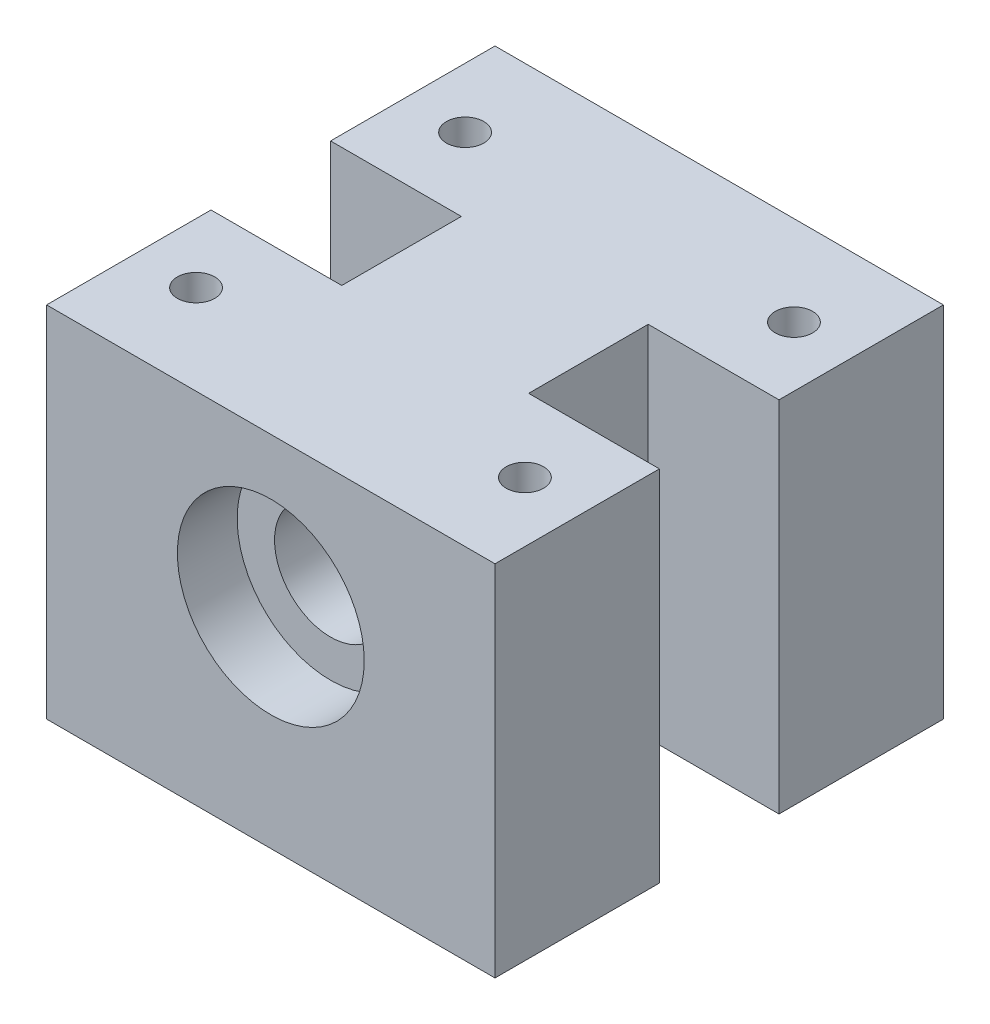
ISO-10303-21;
HEADER;
FILE_DESCRIPTION(('STEP AP214'),'2;1');
FILE_NAME('part.step','',(''),(''),'','','');
FILE_SCHEMA(('AUTOMOTIVE_DESIGN { 1 0 10303 214 1 1 1 1 }'));
ENDSEC;
DATA;
#1=APPLICATION_CONTEXT('core data for automotive mechanical design processes');
#2=APPLICATION_PROTOCOL_DEFINITION('international standard','automotive_design',2000,#1);
#3=PRODUCT_CONTEXT('',#1,'mechanical');
#4=PRODUCT('Part','Part','',(#3));
#5=PRODUCT_RELATED_PRODUCT_CATEGORY('part','',(#4));
#6=PRODUCT_DEFINITION_FORMATION('','',#4);
#7=PRODUCT_DEFINITION_CONTEXT('part definition',#1,'design');
#8=PRODUCT_DEFINITION('design','',#6,#7);
#9=PRODUCT_DEFINITION_SHAPE('','',#8);
#10=(LENGTH_UNIT() NAMED_UNIT(*) SI_UNIT(.MILLI.,.METRE.));
#11=(NAMED_UNIT(*) PLANE_ANGLE_UNIT() SI_UNIT($,.RADIAN.));
#12=(NAMED_UNIT(*) SI_UNIT($,.STERADIAN.) SOLID_ANGLE_UNIT());
#13=UNCERTAINTY_MEASURE_WITH_UNIT(LENGTH_MEASURE(1.E-05),#10,'distance_accuracy_value','');
#14=(GEOMETRIC_REPRESENTATION_CONTEXT(3) GLOBAL_UNCERTAINTY_ASSIGNED_CONTEXT((#13)) GLOBAL_UNIT_ASSIGNED_CONTEXT((#10,
#11,#12)) REPRESENTATION_CONTEXT('',''));
#15=CARTESIAN_POINT('',(0.,0.,0.));
#16=DIRECTION('',(0.,0.,1.));
#17=DIRECTION('',(1.,0.,0.));
#18=AXIS2_PLACEMENT_3D('',#15,#16,#17);
#19=CARTESIAN_POINT('',(-19.05,-17.78,19.05));
#20=DIRECTION('',(1.,0.,0.));
#21=DIRECTION('',(0.,0.,-1.));
#22=AXIS2_PLACEMENT_3D('',#19,#20,#21);
#23=PLANE('',#22);
#24=DIRECTION('',(0.,0.,1.));
#25=VECTOR('',#24,1.);
#26=CARTESIAN_POINT('',(-19.05,12.7,-19.05));
#27=LINE('',#26,#25);
#28=CARTESIAN_POINT('',(-19.05,12.7,-19.05));
#29=VERTEX_POINT('',#28);
#30=CARTESIAN_POINT('',(-19.05,12.7,-5.08));
#31=VERTEX_POINT('',#30);
#32=EDGE_CURVE('E133',#29,#31,#27,.T.);
#33=ORIENTED_EDGE('',*,*,#32,.F.);
#34=DIRECTION('',(0.,-1.,0.));
#35=VECTOR('',#34,1.);
#36=CARTESIAN_POINT('',(-19.05,-17.78,-19.05));
#37=LINE('',#36,#35);
#38=CARTESIAN_POINT('',(-19.05,-17.78,-19.05));
#39=VERTEX_POINT('',#38);
#40=EDGE_CURVE('E224',#29,#39,#37,.T.);
#41=ORIENTED_EDGE('',*,*,#40,.T.);
#42=DIRECTION('',(0.,0.,-1.));
#43=VECTOR('',#42,1.);
#44=CARTESIAN_POINT('',(-19.05,-17.78,19.05));
#45=LINE('',#44,#43);
#46=CARTESIAN_POINT('',(-19.05,-17.78,-5.08));
#47=VERTEX_POINT('',#46);
#48=EDGE_CURVE('E54',#47,#39,#45,.T.);
#49=ORIENTED_EDGE('',*,*,#48,.F.);
#50=DIRECTION('',(0.,1.,0.));
#51=VECTOR('',#50,1.);
#52=CARTESIAN_POINT('',(-19.05,-17.78,-5.08));
#53=LINE('',#52,#51);
#54=EDGE_CURVE('E147',#47,#31,#53,.T.);
#55=ORIENTED_EDGE('',*,*,#54,.T.);
#56=EDGE_LOOP('',(#33,#41,#49,#55));
#57=FACE_BOUND('',#56,.T.);
#58=ADVANCED_FACE('F45',(#57),#23,.F.);
#59=DIRECTION('',(0.,0.,1.));
#60=VECTOR('',#59,1.);
#61=CARTESIAN_POINT('',(-19.05,12.7,5.08));
#62=LINE('',#61,#60);
#63=CARTESIAN_POINT('',(-19.05,12.7,5.08));
#64=VERTEX_POINT('',#63);
#65=CARTESIAN_POINT('',(-19.05,12.7,19.05));
#66=VERTEX_POINT('',#65);
#67=EDGE_CURVE('E276',#64,#66,#62,.T.);
#68=ORIENTED_EDGE('',*,*,#67,.F.);
#69=DIRECTION('',(0.,1.,0.));
#70=VECTOR('',#69,1.);
#71=CARTESIAN_POINT('',(-19.05,-17.78,5.08));
#72=LINE('',#71,#70);
#73=CARTESIAN_POINT('',(-19.05,-17.78,5.08));
#74=VERTEX_POINT('',#73);
#75=EDGE_CURVE('E165',#74,#64,#72,.T.);
#76=ORIENTED_EDGE('',*,*,#75,.F.);
#77=CARTESIAN_POINT('',(-19.05,-17.78,19.05));
#78=VERTEX_POINT('',#77);
#79=EDGE_CURVE('E13',#78,#74,#45,.T.);
#80=ORIENTED_EDGE('',*,*,#79,.F.);
#81=DIRECTION('',(0.,-1.,0.));
#82=VECTOR('',#81,1.);
#83=CARTESIAN_POINT('',(-19.05,-17.78,19.05));
#84=LINE('',#83,#82);
#85=EDGE_CURVE('E216',#66,#78,#84,.T.);
#86=ORIENTED_EDGE('',*,*,#85,.F.);
#87=EDGE_LOOP('',(#68,#76,#80,#86));
#88=FACE_BOUND('',#87,.T.);
#89=ADVANCED_FACE('F274',(#88),#23,.F.);
#90=CARTESIAN_POINT('',(19.05,-17.78,19.05));
#91=DIRECTION('',(-1.,0.,0.));
#92=DIRECTION('',(0.,0.,1.));
#93=AXIS2_PLACEMENT_3D('',#90,#91,#92);
#94=PLANE('',#93);
#95=DIRECTION('',(0.,0.,-1.));
#96=VECTOR('',#95,1.);
#97=CARTESIAN_POINT('',(19.05,12.7,19.05));
#98=LINE('',#97,#96);
#99=CARTESIAN_POINT('',(19.05,12.7,19.05));
#100=VERTEX_POINT('',#99);
#101=CARTESIAN_POINT('',(19.05,12.7,5.08));
#102=VERTEX_POINT('',#101);
#103=EDGE_CURVE('E281',#100,#102,#98,.T.);
#104=ORIENTED_EDGE('',*,*,#103,.F.);
#105=DIRECTION('',(0.,1.,0.));
#106=VECTOR('',#105,1.);
#107=CARTESIAN_POINT('',(19.05,-17.78,19.05));
#108=LINE('',#107,#106);
#109=CARTESIAN_POINT('',(19.05,-17.78,19.05));
#110=VERTEX_POINT('',#109);
#111=EDGE_CURVE('E213',#110,#100,#108,.T.);
#112=ORIENTED_EDGE('',*,*,#111,.F.);
#113=DIRECTION('',(0.,0.,-1.));
#114=VECTOR('',#113,1.);
#115=CARTESIAN_POINT('',(19.05,-17.78,19.05));
#116=LINE('',#115,#114);
#117=CARTESIAN_POINT('',(19.05,-17.78,5.08));
#118=VERTEX_POINT('',#117);
#119=EDGE_CURVE('E228',#110,#118,#116,.T.);
#120=ORIENTED_EDGE('',*,*,#119,.T.);
#121=DIRECTION('',(0.,1.,0.));
#122=VECTOR('',#121,1.);
#123=CARTESIAN_POINT('',(19.05,-17.78,5.08));
#124=LINE('',#123,#122);
#125=EDGE_CURVE('E174',#118,#102,#124,.T.);
#126=ORIENTED_EDGE('',*,*,#125,.T.);
#127=EDGE_LOOP('',(#104,#112,#120,#126));
#128=FACE_BOUND('',#127,.T.);
#129=ADVANCED_FACE('F47',(#128),#94,.F.);
#130=DIRECTION('',(0.,0.,-1.));
#131=VECTOR('',#130,1.);
#132=CARTESIAN_POINT('',(19.05,12.7,-5.08));
#133=LINE('',#132,#131);
#134=CARTESIAN_POINT('',(19.05,12.7,-5.08));
#135=VERTEX_POINT('',#134);
#136=CARTESIAN_POINT('',(19.05,12.7,-19.05));
#137=VERTEX_POINT('',#136);
#138=EDGE_CURVE('E245',#135,#137,#133,.T.);
#139=ORIENTED_EDGE('',*,*,#138,.F.);
#140=DIRECTION('',(0.,1.,0.));
#141=VECTOR('',#140,1.);
#142=CARTESIAN_POINT('',(19.05,-17.78,-5.08));
#143=LINE('',#142,#141);
#144=CARTESIAN_POINT('',(19.05,-17.78,-5.08));
#145=VERTEX_POINT('',#144);
#146=EDGE_CURVE('E173',#145,#135,#143,.T.);
#147=ORIENTED_EDGE('',*,*,#146,.F.);
#148=CARTESIAN_POINT('',(19.05,-17.78,-19.05));
#149=VERTEX_POINT('',#148);
#150=EDGE_CURVE('E221',#145,#149,#116,.T.);
#151=ORIENTED_EDGE('',*,*,#150,.T.);
#152=DIRECTION('',(0.,1.,0.));
#153=VECTOR('',#152,1.);
#154=CARTESIAN_POINT('',(19.05,-17.78,-19.05));
#155=LINE('',#154,#153);
#156=EDGE_CURVE('E210',#149,#137,#155,.T.);
#157=ORIENTED_EDGE('',*,*,#156,.T.);
#158=EDGE_LOOP('',(#139,#147,#151,#157));
#159=FACE_BOUND('',#158,.T.);
#160=ADVANCED_FACE('F237',(#159),#94,.F.);
#161=CARTESIAN_POINT('',(0.,0.,19.05));
#162=DIRECTION('',(0.,0.,-1.));
#163=DIRECTION('',(-1.,0.,0.));
#164=AXIS2_PLACEMENT_3D('',#161,#162,#163);
#165=PLANE('',#164);
#166=CARTESIAN_POINT('',(0.,0.,19.05));
#167=DIRECTION('',(0.,0.,1.));
#168=DIRECTION('',(1.,0.,0.));
#169=AXIS2_PLACEMENT_3D('',#166,#167,#168);
#170=CIRCLE('',#169,7.9375);
#171=CARTESIAN_POINT('',(7.9375,0.,19.05));
#172=VERTEX_POINT('',#171);
#173=EDGE_CURVE('E206',#172,#172,#170,.T.);
#174=ORIENTED_EDGE('',*,*,#173,.F.);
#175=EDGE_LOOP('',(#174));
#176=FACE_BOUND('',#175,.T.);
#177=DIRECTION('',(1.,0.,0.));
#178=VECTOR('',#177,1.);
#179=CARTESIAN_POINT('',(-19.05,12.7,19.05));
#180=LINE('',#179,#178);
#181=EDGE_CURVE('E278',#66,#100,#180,.T.);
#182=ORIENTED_EDGE('',*,*,#181,.F.);
#183=ORIENTED_EDGE('',*,*,#85,.T.);
#184=DIRECTION('',(1.,0.,0.));
#185=VECTOR('',#184,1.);
#186=CARTESIAN_POINT('',(-19.05,-17.78,19.05));
#187=LINE('',#186,#185);
#188=EDGE_CURVE('E219',#78,#110,#187,.T.);
#189=ORIENTED_EDGE('',*,*,#188,.T.);
#190=ORIENTED_EDGE('',*,*,#111,.T.);
#191=EDGE_LOOP('',(#182,#183,#189,#190));
#192=FACE_BOUND('',#191,.T.);
#193=ADVANCED_FACE('F303',(#176,#192),#165,.F.);
#194=CARTESIAN_POINT('',(0.,0.,-19.05));
#195=DIRECTION('',(0.,0.,-1.));
#196=DIRECTION('',(-1.,0.,0.));
#197=AXIS2_PLACEMENT_3D('',#194,#195,#196);
#198=PLANE('',#197);
#199=CARTESIAN_POINT('',(0.,0.,-19.05));
#200=DIRECTION('',(0.,0.,1.));
#201=DIRECTION('',(1.,0.,0.));
#202=AXIS2_PLACEMENT_3D('',#199,#200,#201);
#203=CIRCLE('',#202,7.9375);
#204=CARTESIAN_POINT('',(7.9375,0.,-19.05));
#205=VERTEX_POINT('',#204);
#206=EDGE_CURVE('E197',#205,#205,#203,.T.);
#207=ORIENTED_EDGE('',*,*,#206,.T.);
#208=EDGE_LOOP('',(#207));
#209=FACE_BOUND('',#208,.T.);
#210=ORIENTED_EDGE('',*,*,#40,.F.);
#211=DIRECTION('',(-1.,0.,0.));
#212=VECTOR('',#211,1.);
#213=CARTESIAN_POINT('',(19.05,12.7,-19.05));
#214=LINE('',#213,#212);
#215=EDGE_CURVE('E139',#137,#29,#214,.T.);
#216=ORIENTED_EDGE('',*,*,#215,.F.);
#217=ORIENTED_EDGE('',*,*,#156,.F.);
#218=DIRECTION('',(1.,0.,0.));
#219=VECTOR('',#218,1.);
#220=CARTESIAN_POINT('',(-19.05,-17.78,-19.05));
#221=LINE('',#220,#219);
#222=EDGE_CURVE('E217',#39,#149,#221,.T.);
#223=ORIENTED_EDGE('',*,*,#222,.F.);
#224=EDGE_LOOP('',(#210,#216,#217,#223));
#225=FACE_BOUND('',#224,.T.);
#226=ADVANCED_FACE('F243',(#209,#225),#198,.T.);
#227=CARTESIAN_POINT('',(13.97,17.78,11.43));
#228=DIRECTION('',(0.,-1.,0.));
#229=DIRECTION('',(0.,0.,-1.));
#230=AXIS2_PLACEMENT_3D('',#227,#228,#229);
#231=CYLINDRICAL_SURFACE('',#230,1.5875);
#232=CARTESIAN_POINT('',(13.97,-17.78,11.43));
#233=DIRECTION('',(0.,-1.,0.));
#234=DIRECTION('',(0.,0.,-1.));
#235=AXIS2_PLACEMENT_3D('',#232,#233,#234);
#236=CIRCLE('',#235,1.5875);
#237=CARTESIAN_POINT('',(13.97,-17.78,9.8425));
#238=VERTEX_POINT('',#237);
#239=EDGE_CURVE('E189',#238,#238,#236,.T.);
#240=ORIENTED_EDGE('',*,*,#239,.T.);
#241=EDGE_LOOP('',(#240));
#242=FACE_BOUND('',#241,.T.);
#243=CARTESIAN_POINT('',(13.97,12.7,11.43));
#244=DIRECTION('',(0.,1.,0.));
#245=DIRECTION('',(0.,0.,1.));
#246=AXIS2_PLACEMENT_3D('',#243,#244,#245);
#247=CIRCLE('',#246,1.5875);
#248=CARTESIAN_POINT('',(13.97,12.7,13.0175));
#249=VERTEX_POINT('',#248);
#250=EDGE_CURVE('E259',#249,#249,#247,.F.);
#251=ORIENTED_EDGE('',*,*,#250,.F.);
#252=EDGE_LOOP('',(#251));
#253=FACE_BOUND('',#252,.T.);
#254=ADVANCED_FACE('F311',(#242,#253),#231,.F.);
#255=CARTESIAN_POINT('',(13.97,17.78,-11.43));
#256=DIRECTION('',(0.,-1.,0.));
#257=DIRECTION('',(0.,0.,-1.));
#258=AXIS2_PLACEMENT_3D('',#255,#256,#257);
#259=CYLINDRICAL_SURFACE('',#258,1.5875);
#260=CARTESIAN_POINT('',(13.97,-17.78,-11.43));
#261=DIRECTION('',(0.,-1.,0.));
#262=DIRECTION('',(0.,0.,-1.));
#263=AXIS2_PLACEMENT_3D('',#260,#261,#262);
#264=CIRCLE('',#263,1.5875);
#265=CARTESIAN_POINT('',(13.97,-17.78,-13.0175));
#266=VERTEX_POINT('',#265);
#267=EDGE_CURVE('E186',#266,#266,#264,.T.);
#268=ORIENTED_EDGE('',*,*,#267,.T.);
#269=EDGE_LOOP('',(#268));
#270=FACE_BOUND('',#269,.T.);
#271=CARTESIAN_POINT('',(13.97,12.7,-11.43));
#272=DIRECTION('',(0.,1.,0.));
#273=DIRECTION('',(0.,0.,1.));
#274=AXIS2_PLACEMENT_3D('',#271,#272,#273);
#275=CIRCLE('',#274,1.5875);
#276=CARTESIAN_POINT('',(13.97,12.7,-9.8425));
#277=VERTEX_POINT('',#276);
#278=EDGE_CURVE('E256',#277,#277,#275,.F.);
#279=ORIENTED_EDGE('',*,*,#278,.F.);
#280=EDGE_LOOP('',(#279));
#281=FACE_BOUND('',#280,.T.);
#282=ADVANCED_FACE('F357',(#270,#281),#259,.F.);
#283=CARTESIAN_POINT('',(-13.97,17.78,-11.43));
#284=DIRECTION('',(0.,-1.,0.));
#285=DIRECTION('',(0.,0.,-1.));
#286=AXIS2_PLACEMENT_3D('',#283,#284,#285);
#287=CYLINDRICAL_SURFACE('',#286,1.5875);
#288=CARTESIAN_POINT('',(-13.97,-17.78,-11.43));
#289=DIRECTION('',(0.,-1.,0.));
#290=DIRECTION('',(0.,0.,-1.));
#291=AXIS2_PLACEMENT_3D('',#288,#289,#290);
#292=CIRCLE('',#291,1.5875);
#293=CARTESIAN_POINT('',(-13.97,-17.78,-13.0175));
#294=VERTEX_POINT('',#293);
#295=EDGE_CURVE('E190',#294,#294,#292,.T.);
#296=ORIENTED_EDGE('',*,*,#295,.T.);
#297=EDGE_LOOP('',(#296));
#298=FACE_BOUND('',#297,.T.);
#299=CARTESIAN_POINT('',(-13.97,12.7,-11.43));
#300=DIRECTION('',(0.,1.,0.));
#301=DIRECTION('',(0.,0.,1.));
#302=AXIS2_PLACEMENT_3D('',#299,#300,#301);
#303=CIRCLE('',#302,1.5875);
#304=CARTESIAN_POINT('',(-13.97,12.7,-9.8425));
#305=VERTEX_POINT('',#304);
#306=EDGE_CURVE('E248',#305,#305,#303,.F.);
#307=ORIENTED_EDGE('',*,*,#306,.F.);
#308=EDGE_LOOP('',(#307));
#309=FACE_BOUND('',#308,.T.);
#310=ADVANCED_FACE('F343',(#298,#309),#287,.F.);
#311=CARTESIAN_POINT('',(-13.97,17.78,11.43));
#312=DIRECTION('',(0.,-1.,0.));
#313=DIRECTION('',(0.,0.,-1.));
#314=AXIS2_PLACEMENT_3D('',#311,#312,#313);
#315=CYLINDRICAL_SURFACE('',#314,1.5875);
#316=CARTESIAN_POINT('',(-13.97,-17.78,11.43));
#317=DIRECTION('',(0.,-1.,0.));
#318=DIRECTION('',(0.,0.,-1.));
#319=AXIS2_PLACEMENT_3D('',#316,#317,#318);
#320=CIRCLE('',#319,1.5875);
#321=CARTESIAN_POINT('',(-13.97,-17.78,9.8425));
#322=VERTEX_POINT('',#321);
#323=EDGE_CURVE('E177',#322,#322,#320,.T.);
#324=ORIENTED_EDGE('',*,*,#323,.T.);
#325=EDGE_LOOP('',(#324));
#326=FACE_BOUND('',#325,.T.);
#327=CARTESIAN_POINT('',(-13.97,12.7,11.43));
#328=DIRECTION('',(0.,1.,0.));
#329=DIRECTION('',(0.,0.,1.));
#330=AXIS2_PLACEMENT_3D('',#327,#328,#329);
#331=CIRCLE('',#330,1.5875);
#332=CARTESIAN_POINT('',(-13.97,12.7,13.0175));
#333=VERTEX_POINT('',#332);
#334=EDGE_CURVE('E244',#333,#333,#331,.F.);
#335=ORIENTED_EDGE('',*,*,#334,.F.);
#336=EDGE_LOOP('',(#335));
#337=FACE_BOUND('',#336,.T.);
#338=ADVANCED_FACE('F340',(#326,#337),#315,.F.);
#339=CARTESIAN_POINT('',(19.05,-17.78,5.08));
#340=DIRECTION('',(0.,0.,1.));
#341=DIRECTION('',(1.,0.,0.));
#342=AXIS2_PLACEMENT_3D('',#339,#340,#341);
#343=PLANE('',#342);
#344=DIRECTION('',(-1.,0.,0.));
#345=VECTOR('',#344,1.);
#346=CARTESIAN_POINT('',(19.05,12.7,5.08));
#347=LINE('',#346,#345);
#348=CARTESIAN_POINT('',(7.9375,12.7,5.08));
#349=VERTEX_POINT('',#348);
#350=EDGE_CURVE('E287',#102,#349,#347,.T.);
#351=ORIENTED_EDGE('',*,*,#350,.F.);
#352=ORIENTED_EDGE('',*,*,#125,.F.);
#353=DIRECTION('',(1.,0.,0.));
#354=VECTOR('',#353,1.);
#355=CARTESIAN_POINT('',(19.05,-17.78,5.08));
#356=LINE('',#355,#354);
#357=CARTESIAN_POINT('',(7.9375,-17.78,5.08));
#358=VERTEX_POINT('',#357);
#359=EDGE_CURVE('E170',#358,#118,#356,.T.);
#360=ORIENTED_EDGE('',*,*,#359,.F.);
#361=DIRECTION('',(0.,1.,0.));
#362=VECTOR('',#361,1.);
#363=CARTESIAN_POINT('',(7.9375,-17.78,5.08));
#364=LINE('',#363,#362);
#365=EDGE_CURVE('E178',#358,#349,#364,.T.);
#366=ORIENTED_EDGE('',*,*,#365,.T.);
#367=EDGE_LOOP('',(#351,#352,#360,#366));
#368=FACE_BOUND('',#367,.T.);
#369=ADVANCED_FACE('F300',(#368),#343,.F.);
#370=CARTESIAN_POINT('',(7.9375,-17.78,-5.08));
#371=DIRECTION('',(-1.,0.,0.));
#372=DIRECTION('',(0.,0.,1.));
#373=AXIS2_PLACEMENT_3D('',#370,#371,#372);
#374=PLANE('',#373);
#375=DIRECTION('',(0.,0.,-1.));
#376=VECTOR('',#375,1.);
#377=CARTESIAN_POINT('',(7.9375,12.7,5.08));
#378=LINE('',#377,#376);
#379=CARTESIAN_POINT('',(7.9375,12.7,-5.08));
#380=VERTEX_POINT('',#379);
#381=EDGE_CURVE('E289',#349,#380,#378,.T.);
#382=ORIENTED_EDGE('',*,*,#381,.F.);
#383=ORIENTED_EDGE('',*,*,#365,.F.);
#384=DIRECTION('',(0.,0.,1.));
#385=VECTOR('',#384,1.);
#386=CARTESIAN_POINT('',(7.9375,-17.78,-5.08));
#387=LINE('',#386,#385);
#388=CARTESIAN_POINT('',(7.9375,-17.78,-5.08));
#389=VERTEX_POINT('',#388);
#390=EDGE_CURVE('E157',#389,#358,#387,.T.);
#391=ORIENTED_EDGE('',*,*,#390,.F.);
#392=DIRECTION('',(0.,1.,0.));
#393=VECTOR('',#392,1.);
#394=CARTESIAN_POINT('',(7.9375,-17.78,-5.08));
#395=LINE('',#394,#393);
#396=EDGE_CURVE('E181',#389,#380,#395,.T.);
#397=ORIENTED_EDGE('',*,*,#396,.T.);
#398=EDGE_LOOP('',(#382,#383,#391,#397));
#399=FACE_BOUND('',#398,.T.);
#400=ADVANCED_FACE('F297',(#399),#374,.F.);
#401=CARTESIAN_POINT('',(19.05,-17.78,-5.08));
#402=DIRECTION('',(0.,0.,-1.));
#403=DIRECTION('',(-1.,0.,0.));
#404=AXIS2_PLACEMENT_3D('',#401,#402,#403);
#405=PLANE('',#404);
#406=DIRECTION('',(1.,0.,0.));
#407=VECTOR('',#406,1.);
#408=CARTESIAN_POINT('',(7.9375,12.7,-5.08));
#409=LINE('',#408,#407);
#410=EDGE_CURVE('E250',#380,#135,#409,.T.);
#411=ORIENTED_EDGE('',*,*,#410,.F.);
#412=ORIENTED_EDGE('',*,*,#396,.F.);
#413=DIRECTION('',(-1.,0.,0.));
#414=VECTOR('',#413,1.);
#415=CARTESIAN_POINT('',(19.05,-17.78,-5.08));
#416=LINE('',#415,#414);
#417=EDGE_CURVE('E154',#145,#389,#416,.T.);
#418=ORIENTED_EDGE('',*,*,#417,.F.);
#419=ORIENTED_EDGE('',*,*,#146,.T.);
#420=EDGE_LOOP('',(#411,#412,#418,#419));
#421=FACE_BOUND('',#420,.T.);
#422=ADVANCED_FACE('F294',(#421),#405,.F.);
#423=CARTESIAN_POINT('',(-19.05,-17.78,-5.08));
#424=DIRECTION('',(0.,0.,1.));
#425=DIRECTION('',(1.,0.,0.));
#426=AXIS2_PLACEMENT_3D('',#423,#424,#425);
#427=PLANE('',#426);
#428=DIRECTION('',(0.,1.,0.));
#429=VECTOR('',#428,1.);
#430=CARTESIAN_POINT('',(-7.9375,-17.78,-5.08));
#431=LINE('',#430,#429);
#432=CARTESIAN_POINT('',(-7.9375,-17.78,-5.08));
#433=VERTEX_POINT('',#432);
#434=CARTESIAN_POINT('',(-7.9375,12.7,-5.08));
#435=VERTEX_POINT('',#434);
#436=EDGE_CURVE('E150',#433,#435,#431,.T.);
#437=ORIENTED_EDGE('',*,*,#436,.T.);
#438=DIRECTION('',(1.,0.,0.));
#439=VECTOR('',#438,1.);
#440=CARTESIAN_POINT('',(-19.05,12.7,-5.08));
#441=LINE('',#440,#439);
#442=EDGE_CURVE('E137',#31,#435,#441,.T.);
#443=ORIENTED_EDGE('',*,*,#442,.F.);
#444=ORIENTED_EDGE('',*,*,#54,.F.);
#445=DIRECTION('',(1.,0.,0.));
#446=VECTOR('',#445,1.);
#447=CARTESIAN_POINT('',(-19.05,-17.78,-5.08));
#448=LINE('',#447,#446);
#449=EDGE_CURVE('E161',#47,#433,#448,.T.);
#450=ORIENTED_EDGE('',*,*,#449,.T.);
#451=EDGE_LOOP('',(#437,#443,#444,#450));
#452=FACE_BOUND('',#451,.T.);
#453=ADVANCED_FACE('F146',(#452),#427,.T.);
#454=CARTESIAN_POINT('',(-7.9375,-17.78,-5.08));
#455=DIRECTION('',(-1.,0.,0.));
#456=DIRECTION('',(0.,0.,1.));
#457=AXIS2_PLACEMENT_3D('',#454,#455,#456);
#458=PLANE('',#457);
#459=DIRECTION('',(0.,1.,0.));
#460=VECTOR('',#459,1.);
#461=CARTESIAN_POINT('',(-7.9375,-17.78,5.08));
#462=LINE('',#461,#460);
#463=CARTESIAN_POINT('',(-7.9375,-17.78,5.08));
#464=VERTEX_POINT('',#463);
#465=CARTESIAN_POINT('',(-7.9375,12.7,5.08));
#466=VERTEX_POINT('',#465);
#467=EDGE_CURVE('E68',#464,#466,#462,.T.);
#468=ORIENTED_EDGE('',*,*,#467,.T.);
#469=DIRECTION('',(0.,0.,1.));
#470=VECTOR('',#469,1.);
#471=CARTESIAN_POINT('',(-7.9375,12.7,-5.08));
#472=LINE('',#471,#470);
#473=EDGE_CURVE('E61',#435,#466,#472,.T.);
#474=ORIENTED_EDGE('',*,*,#473,.F.);
#475=ORIENTED_EDGE('',*,*,#436,.F.);
#476=DIRECTION('',(0.,0.,1.));
#477=VECTOR('',#476,1.);
#478=CARTESIAN_POINT('',(-7.9375,-17.78,-5.08));
#479=LINE('',#478,#477);
#480=EDGE_CURVE('E263',#433,#464,#479,.T.);
#481=ORIENTED_EDGE('',*,*,#480,.T.);
#482=EDGE_LOOP('',(#468,#474,#475,#481));
#483=FACE_BOUND('',#482,.T.);
#484=ADVANCED_FACE('F267',(#483),#458,.T.);
#485=CARTESIAN_POINT('',(-19.05,-17.78,5.08));
#486=DIRECTION('',(0.,0.,-1.));
#487=DIRECTION('',(-1.,0.,0.));
#488=AXIS2_PLACEMENT_3D('',#485,#486,#487);
#489=PLANE('',#488);
#490=ORIENTED_EDGE('',*,*,#75,.T.);
#491=DIRECTION('',(-1.,0.,0.));
#492=VECTOR('',#491,1.);
#493=CARTESIAN_POINT('',(-7.9375,12.7,5.08));
#494=LINE('',#493,#492);
#495=EDGE_CURVE('E279',#466,#64,#494,.T.);
#496=ORIENTED_EDGE('',*,*,#495,.F.);
#497=ORIENTED_EDGE('',*,*,#467,.F.);
#498=DIRECTION('',(-1.,0.,0.));
#499=VECTOR('',#498,1.);
#500=CARTESIAN_POINT('',(-19.05,-17.78,5.08));
#501=LINE('',#500,#499);
#502=EDGE_CURVE('E262',#464,#74,#501,.T.);
#503=ORIENTED_EDGE('',*,*,#502,.T.);
#504=EDGE_LOOP('',(#490,#496,#497,#503));
#505=FACE_BOUND('',#504,.T.);
#506=ADVANCED_FACE('F271',(#505),#489,.T.);
#507=CARTESIAN_POINT('',(-19.05,-17.78,19.05));
#508=DIRECTION('',(0.,1.,0.));
#509=DIRECTION('',(0.,0.,1.));
#510=AXIS2_PLACEMENT_3D('',#507,#508,#509);
#511=PLANE('',#510);
#512=ORIENTED_EDGE('',*,*,#239,.F.);
#513=EDGE_LOOP('',(#512));
#514=FACE_BOUND('',#513,.T.);
#515=ORIENTED_EDGE('',*,*,#267,.F.);
#516=EDGE_LOOP('',(#515));
#517=FACE_BOUND('',#516,.T.);
#518=ORIENTED_EDGE('',*,*,#295,.F.);
#519=EDGE_LOOP('',(#518));
#520=FACE_BOUND('',#519,.T.);
#521=ORIENTED_EDGE('',*,*,#323,.F.);
#522=EDGE_LOOP('',(#521));
#523=FACE_BOUND('',#522,.T.);
#524=ORIENTED_EDGE('',*,*,#449,.F.);
#525=ORIENTED_EDGE('',*,*,#48,.T.);
#526=ORIENTED_EDGE('',*,*,#222,.T.);
#527=ORIENTED_EDGE('',*,*,#150,.F.);
#528=ORIENTED_EDGE('',*,*,#417,.T.);
#529=ORIENTED_EDGE('',*,*,#390,.T.);
#530=ORIENTED_EDGE('',*,*,#359,.T.);
#531=ORIENTED_EDGE('',*,*,#119,.F.);
#532=ORIENTED_EDGE('',*,*,#188,.F.);
#533=ORIENTED_EDGE('',*,*,#79,.T.);
#534=ORIENTED_EDGE('',*,*,#502,.F.);
#535=ORIENTED_EDGE('',*,*,#480,.F.);
#536=EDGE_LOOP('',(#524,#525,#526,#527,#528,#529,#530,#531,#532,#533,#534,#535));
#537=FACE_BOUND('',#536,.T.);
#538=ADVANCED_FACE('F241',(#514,#517,#520,#523,#537),#511,.F.);
#539=CARTESIAN_POINT('',(0.,0.,-19.05));
#540=DIRECTION('',(0.,0.,1.));
#541=DIRECTION('',(1.,0.,0.));
#542=AXIS2_PLACEMENT_3D('',#539,#540,#541);
#543=CYLINDRICAL_SURFACE('',#542,4.7625);
#544=CARTESIAN_POINT('',(0.,0.,13.97));
#545=DIRECTION('',(0.,0.,1.));
#546=DIRECTION('',(1.,0.,0.));
#547=AXIS2_PLACEMENT_3D('',#544,#545,#546);
#548=CIRCLE('',#547,4.7625);
#549=CARTESIAN_POINT('',(4.7625,0.,13.97));
#550=VERTEX_POINT('',#549);
#551=EDGE_CURVE('E203',#550,#550,#548,.T.);
#552=ORIENTED_EDGE('',*,*,#551,.T.);
#553=EDGE_LOOP('',(#552));
#554=FACE_BOUND('',#553,.T.);
#555=CARTESIAN_POINT('',(0.,0.,-13.97));
#556=DIRECTION('',(0.,0.,-1.));
#557=DIRECTION('',(-1.,0.,0.));
#558=AXIS2_PLACEMENT_3D('',#555,#556,#557);
#559=CIRCLE('',#558,4.7625);
#560=CARTESIAN_POINT('',(-4.7625,0.,-13.97));
#561=VERTEX_POINT('',#560);
#562=EDGE_CURVE('E49',#561,#561,#559,.F.);
#563=ORIENTED_EDGE('',*,*,#562,.F.);
#564=EDGE_LOOP('',(#563));
#565=FACE_BOUND('',#564,.T.);
#566=ADVANCED_FACE('F322',(#554,#565),#543,.F.);
#567=CARTESIAN_POINT('',(0.,0.,13.97));
#568=DIRECTION('',(0.,0.,1.));
#569=DIRECTION('',(1.,0.,0.));
#570=AXIS2_PLACEMENT_3D('',#567,#568,#569);
#571=CYLINDRICAL_SURFACE('',#570,7.9375);
#572=CARTESIAN_POINT('',(0.,0.,13.97));
#573=DIRECTION('',(0.,0.,1.));
#574=DIRECTION('',(1.,0.,0.));
#575=AXIS2_PLACEMENT_3D('',#572,#573,#574);
#576=CIRCLE('',#575,7.9375);
#577=CARTESIAN_POINT('',(7.9375,0.,13.97));
#578=VERTEX_POINT('',#577);
#579=EDGE_CURVE('E207',#578,#578,#576,.T.);
#580=ORIENTED_EDGE('',*,*,#579,.F.);
#581=EDGE_LOOP('',(#580));
#582=FACE_BOUND('',#581,.T.);
#583=ORIENTED_EDGE('',*,*,#173,.T.);
#584=EDGE_LOOP('',(#583));
#585=FACE_BOUND('',#584,.T.);
#586=ADVANCED_FACE('F328',(#582,#585),#571,.F.);
#587=CARTESIAN_POINT('',(0.,0.,13.97));
#588=DIRECTION('',(0.,0.,1.));
#589=DIRECTION('',(1.,0.,0.));
#590=AXIS2_PLACEMENT_3D('',#587,#588,#589);
#591=PLANE('',#590);
#592=ORIENTED_EDGE('',*,*,#551,.F.);
#593=EDGE_LOOP('',(#592));
#594=FACE_BOUND('',#593,.T.);
#595=ORIENTED_EDGE('',*,*,#579,.T.);
#596=EDGE_LOOP('',(#595));
#597=FACE_BOUND('',#596,.T.);
#598=ADVANCED_FACE('F370',(#594,#597),#591,.T.);
#599=CARTESIAN_POINT('',(0.,0.,-13.97));
#600=DIRECTION('',(0.,0.,-1.));
#601=DIRECTION('',(1.,0.,0.));
#602=AXIS2_PLACEMENT_3D('',#599,#600,#601);
#603=PLANE('',#602);
#604=CARTESIAN_POINT('',(0.,0.,-13.97));
#605=DIRECTION('',(0.,0.,1.));
#606=DIRECTION('',(1.,0.,0.));
#607=AXIS2_PLACEMENT_3D('',#604,#605,#606);
#608=CIRCLE('',#607,7.9375);
#609=CARTESIAN_POINT('',(7.9375,0.,-13.97));
#610=VERTEX_POINT('',#609);
#611=EDGE_CURVE('E198',#610,#610,#608,.T.);
#612=ORIENTED_EDGE('',*,*,#611,.F.);
#613=EDGE_LOOP('',(#612));
#614=FACE_BOUND('',#613,.T.);
#615=ORIENTED_EDGE('',*,*,#562,.T.);
#616=EDGE_LOOP('',(#615));
#617=FACE_BOUND('',#616,.T.);
#618=ADVANCED_FACE('F367',(#614,#617),#603,.T.);
#619=CARTESIAN_POINT('',(0.,0.,-13.97));
#620=DIRECTION('',(0.,0.,-1.));
#621=DIRECTION('',(-1.,0.,0.));
#622=AXIS2_PLACEMENT_3D('',#619,#620,#621);
#623=CYLINDRICAL_SURFACE('',#622,7.9375);
#624=ORIENTED_EDGE('',*,*,#611,.T.);
#625=EDGE_LOOP('',(#624));
#626=FACE_BOUND('',#625,.T.);
#627=ORIENTED_EDGE('',*,*,#206,.F.);
#628=EDGE_LOOP('',(#627));
#629=FACE_BOUND('',#628,.T.);
#630=ADVANCED_FACE('F348',(#626,#629),#623,.F.);
#631=CARTESIAN_POINT('',(0.,12.7,0.));
#632=DIRECTION('',(0.,1.,0.));
#633=DIRECTION('',(0.,0.,1.));
#634=AXIS2_PLACEMENT_3D('',#631,#632,#633);
#635=PLANE('',#634);
#636=ORIENTED_EDGE('',*,*,#32,.T.);
#637=ORIENTED_EDGE('',*,*,#442,.T.);
#638=ORIENTED_EDGE('',*,*,#473,.T.);
#639=ORIENTED_EDGE('',*,*,#495,.T.);
#640=ORIENTED_EDGE('',*,*,#67,.T.);
#641=ORIENTED_EDGE('',*,*,#181,.T.);
#642=ORIENTED_EDGE('',*,*,#103,.T.);
#643=ORIENTED_EDGE('',*,*,#350,.T.);
#644=ORIENTED_EDGE('',*,*,#381,.T.);
#645=ORIENTED_EDGE('',*,*,#410,.T.);
#646=ORIENTED_EDGE('',*,*,#138,.T.);
#647=ORIENTED_EDGE('',*,*,#215,.T.);
#648=EDGE_LOOP('',(#636,#637,#638,#639,#640,#641,#642,#643,#644,#645,#646,#647));
#649=FACE_BOUND('',#648,.T.);
#650=ORIENTED_EDGE('',*,*,#334,.T.);
#651=EDGE_LOOP('',(#650));
#652=FACE_BOUND('',#651,.T.);
#653=ORIENTED_EDGE('',*,*,#306,.T.);
#654=EDGE_LOOP('',(#653));
#655=FACE_BOUND('',#654,.T.);
#656=ORIENTED_EDGE('',*,*,#278,.T.);
#657=EDGE_LOOP('',(#656));
#658=FACE_BOUND('',#657,.T.);
#659=ORIENTED_EDGE('',*,*,#250,.T.);
#660=EDGE_LOOP('',(#659));
#661=FACE_BOUND('',#660,.T.);
#662=ADVANCED_FACE('F135',(#649,#652,#655,#658,#661),#635,.T.);
#663=CLOSED_SHELL('',(#58,#89,#129,#160,#193,#226,#254,#282,#310,#338,#369,#400,#422,#453,#484,
#506,#538,#566,#586,#598,#618,#630,#662));
#664=MANIFOLD_SOLID_BREP('B2',#663);
#665=ADVANCED_BREP_SHAPE_REPRESENTATION('',(#18,#664),#14);
#666=SHAPE_DEFINITION_REPRESENTATION(#9,#665);
ENDSEC;
END-ISO-10303-21;
